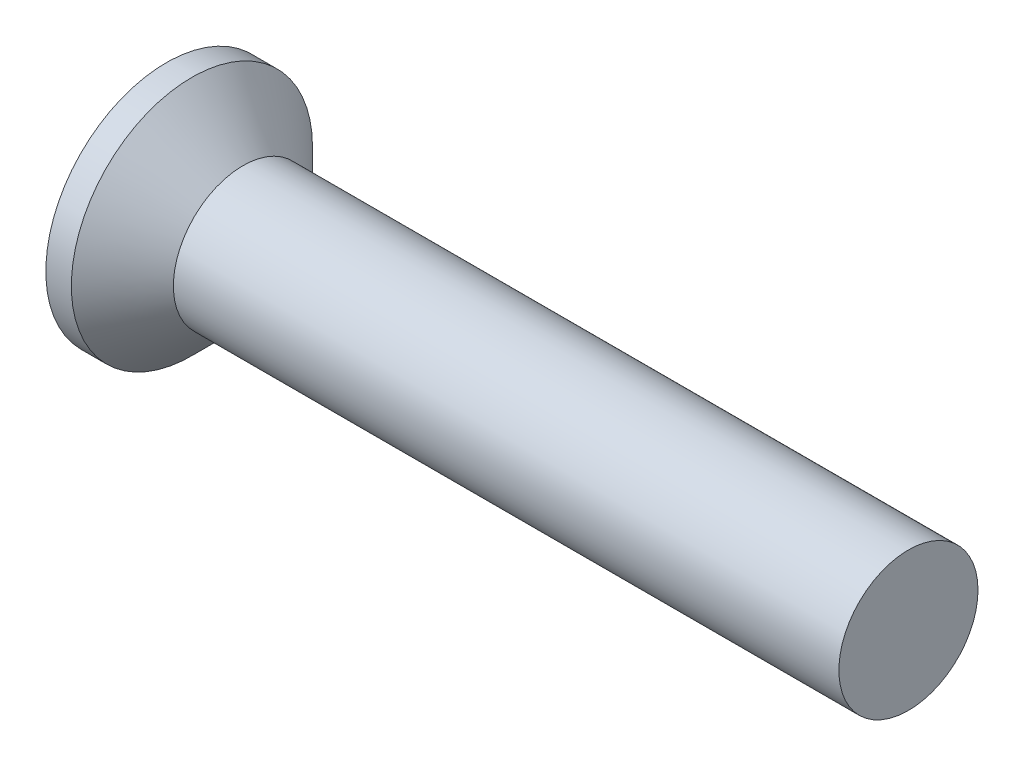
ISO-10303-21;
HEADER;
FILE_DESCRIPTION(('STEP AP214'),'2;1');
FILE_NAME('part.step','',(''),(''),'','','');
FILE_SCHEMA(('AUTOMOTIVE_DESIGN { 1 0 10303 214 1 1 1 1 }'));
ENDSEC;
DATA;
#1=APPLICATION_CONTEXT('core data for automotive mechanical design processes');
#2=APPLICATION_PROTOCOL_DEFINITION('international standard','automotive_design',2000,#1);
#3=PRODUCT_CONTEXT('',#1,'mechanical');
#4=PRODUCT('Part','Part','',(#3));
#5=PRODUCT_RELATED_PRODUCT_CATEGORY('part','',(#4));
#6=PRODUCT_DEFINITION_FORMATION('','',#4);
#7=PRODUCT_DEFINITION_CONTEXT('part definition',#1,'design');
#8=PRODUCT_DEFINITION('design','',#6,#7);
#9=PRODUCT_DEFINITION_SHAPE('','',#8);
#10=(LENGTH_UNIT() NAMED_UNIT(*) SI_UNIT(.MILLI.,.METRE.));
#11=(NAMED_UNIT(*) PLANE_ANGLE_UNIT() SI_UNIT($,.RADIAN.));
#12=(NAMED_UNIT(*) SI_UNIT($,.STERADIAN.) SOLID_ANGLE_UNIT());
#13=UNCERTAINTY_MEASURE_WITH_UNIT(LENGTH_MEASURE(1.E-05),#10,'distance_accuracy_value','');
#14=(GEOMETRIC_REPRESENTATION_CONTEXT(3) GLOBAL_UNCERTAINTY_ASSIGNED_CONTEXT((#13)) GLOBAL_UNIT_ASSIGNED_CONTEXT((#10,
#11,#12)) REPRESENTATION_CONTEXT('',''));
#15=CARTESIAN_POINT('',(0.,0.,0.));
#16=DIRECTION('',(0.,0.,1.));
#17=DIRECTION('',(1.,0.,0.));
#18=AXIS2_PLACEMENT_3D('',#15,#16,#17);
#19=CARTESIAN_POINT('',(0.,2.59999999999999,0.));
#20=DIRECTION('',(-1.,0.,0.));
#21=DIRECTION('',(0.,0.,1.));
#22=AXIS2_PLACEMENT_3D('',#19,#20,#21);
#23=PLANE('',#22);
#24=CARTESIAN_POINT('',(0.,0.,0.));
#25=DIRECTION('',(1.,0.,0.));
#26=DIRECTION('',(0.,0.,-1.));
#27=AXIS2_PLACEMENT_3D('',#24,#25,#26);
#28=CIRCLE('',#27,2.59999999999999);
#29=CARTESIAN_POINT('',(0.,0.,-2.59999999999999));
#30=VERTEX_POINT('',#29);
#31=EDGE_CURVE('E205',#30,#30,#28,.T.);
#32=ORIENTED_EDGE('',*,*,#31,.F.);
#33=EDGE_LOOP('',(#32));
#34=FACE_BOUND('',#33,.T.);
#35=DIRECTION('',(0.,1.,0.));
#36=VECTOR('',#35,1.);
#37=CARTESIAN_POINT('',(0.,-0.32,-0.32));
#38=LINE('',#37,#36);
#39=CARTESIAN_POINT('',(0.,-1.6,-0.32));
#40=VERTEX_POINT('',#39);
#41=CARTESIAN_POINT('',(0.,-0.62,-0.32));
#42=VERTEX_POINT('',#41);
#43=EDGE_CURVE('E354',#40,#42,#38,.T.);
#44=ORIENTED_EDGE('',*,*,#43,.T.);
#45=CARTESIAN_POINT('',(0.,-0.62,-0.62));
#46=DIRECTION('',(-1.,0.,0.));
#47=DIRECTION('',(0.,0.,1.));
#48=AXIS2_PLACEMENT_3D('',#45,#46,#47);
#49=CIRCLE('',#48,0.3);
#50=CARTESIAN_POINT('',(0.,-0.32,-0.62));
#51=VERTEX_POINT('',#50);
#52=EDGE_CURVE('E213',#42,#51,#49,.T.);
#53=ORIENTED_EDGE('',*,*,#52,.T.);
#54=DIRECTION('',(0.,0.,-1.));
#55=VECTOR('',#54,1.);
#56=CARTESIAN_POINT('',(0.,-0.32,-0.32));
#57=LINE('',#56,#55);
#58=CARTESIAN_POINT('',(0.,-0.32,-1.6));
#59=VERTEX_POINT('',#58);
#60=EDGE_CURVE('E357',#51,#59,#57,.T.);
#61=ORIENTED_EDGE('',*,*,#60,.T.);
#62=DIRECTION('',(0.,1.,0.));
#63=VECTOR('',#62,1.);
#64=CARTESIAN_POINT('',(0.,0.32,-1.6));
#65=LINE('',#64,#63);
#66=CARTESIAN_POINT('',(0.,0.32,-1.6));
#67=VERTEX_POINT('',#66);
#68=EDGE_CURVE('E360',#59,#67,#65,.T.);
#69=ORIENTED_EDGE('',*,*,#68,.T.);
#70=DIRECTION('',(0.,0.,1.));
#71=VECTOR('',#70,1.);
#72=CARTESIAN_POINT('',(0.,0.32,-0.32));
#73=LINE('',#72,#71);
#74=CARTESIAN_POINT('',(0.,0.32,-0.62));
#75=VERTEX_POINT('',#74);
#76=EDGE_CURVE('E364',#67,#75,#73,.T.);
#77=ORIENTED_EDGE('',*,*,#76,.T.);
#78=CARTESIAN_POINT('',(0.,0.62,-0.62));
#79=DIRECTION('',(-1.,0.,0.));
#80=DIRECTION('',(0.,0.,1.));
#81=AXIS2_PLACEMENT_3D('',#78,#79,#80);
#82=CIRCLE('',#81,0.3);
#83=CARTESIAN_POINT('',(0.,0.62,-0.32));
#84=VERTEX_POINT('',#83);
#85=EDGE_CURVE('E210',#75,#84,#82,.T.);
#86=ORIENTED_EDGE('',*,*,#85,.T.);
#87=DIRECTION('',(0.,1.,0.));
#88=VECTOR('',#87,1.);
#89=CARTESIAN_POINT('',(0.,0.32,-0.32));
#90=LINE('',#89,#88);
#91=CARTESIAN_POINT('',(0.,1.6,-0.32));
#92=VERTEX_POINT('',#91);
#93=EDGE_CURVE('E368',#84,#92,#90,.T.);
#94=ORIENTED_EDGE('',*,*,#93,.T.);
#95=DIRECTION('',(0.,0.,1.));
#96=VECTOR('',#95,1.);
#97=CARTESIAN_POINT('',(0.,1.6,-0.32));
#98=LINE('',#97,#96);
#99=CARTESIAN_POINT('',(0.,1.6,0.32));
#100=VERTEX_POINT('',#99);
#101=EDGE_CURVE('E371',#92,#100,#98,.T.);
#102=ORIENTED_EDGE('',*,*,#101,.T.);
#103=DIRECTION('',(0.,-1.,0.));
#104=VECTOR('',#103,1.);
#105=CARTESIAN_POINT('',(0.,0.32,0.32));
#106=LINE('',#105,#104);
#107=CARTESIAN_POINT('',(0.,0.62,0.32));
#108=VERTEX_POINT('',#107);
#109=EDGE_CURVE('E375',#100,#108,#106,.T.);
#110=ORIENTED_EDGE('',*,*,#109,.T.);
#111=CARTESIAN_POINT('',(0.,0.62,0.62));
#112=DIRECTION('',(-1.,0.,0.));
#113=DIRECTION('',(0.,0.,1.));
#114=AXIS2_PLACEMENT_3D('',#111,#112,#113);
#115=CIRCLE('',#114,0.3);
#116=CARTESIAN_POINT('',(0.,0.32,0.62));
#117=VERTEX_POINT('',#116);
#118=EDGE_CURVE('E167',#108,#117,#115,.T.);
#119=ORIENTED_EDGE('',*,*,#118,.T.);
#120=DIRECTION('',(0.,0.,1.));
#121=VECTOR('',#120,1.);
#122=CARTESIAN_POINT('',(0.,0.32,0.32));
#123=LINE('',#122,#121);
#124=CARTESIAN_POINT('',(0.,0.32,1.6));
#125=VERTEX_POINT('',#124);
#126=EDGE_CURVE('E161',#117,#125,#123,.T.);
#127=ORIENTED_EDGE('',*,*,#126,.T.);
#128=DIRECTION('',(0.,-1.,0.));
#129=VECTOR('',#128,1.);
#130=CARTESIAN_POINT('',(0.,0.32,1.6));
#131=LINE('',#130,#129);
#132=CARTESIAN_POINT('',(0.,-0.32,1.6));
#133=VERTEX_POINT('',#132);
#134=EDGE_CURVE('E165',#125,#133,#131,.T.);
#135=ORIENTED_EDGE('',*,*,#134,.T.);
#136=DIRECTION('',(0.,0.,-1.));
#137=VECTOR('',#136,1.);
#138=CARTESIAN_POINT('',(0.,-0.32,0.32));
#139=LINE('',#138,#137);
#140=CARTESIAN_POINT('',(0.,-0.32,0.62));
#141=VERTEX_POINT('',#140);
#142=EDGE_CURVE('E181',#133,#141,#139,.T.);
#143=ORIENTED_EDGE('',*,*,#142,.T.);
#144=CARTESIAN_POINT('',(0.,-0.62,0.62));
#145=DIRECTION('',(-1.,0.,0.));
#146=DIRECTION('',(0.,0.,1.));
#147=AXIS2_PLACEMENT_3D('',#144,#145,#146);
#148=CIRCLE('',#147,0.3);
#149=CARTESIAN_POINT('',(0.,-0.62,0.32));
#150=VERTEX_POINT('',#149);
#151=EDGE_CURVE('E204',#141,#150,#148,.T.);
#152=ORIENTED_EDGE('',*,*,#151,.T.);
#153=DIRECTION('',(0.,-1.,0.));
#154=VECTOR('',#153,1.);
#155=CARTESIAN_POINT('',(0.,-0.32,0.32));
#156=LINE('',#155,#154);
#157=CARTESIAN_POINT('',(0.,-1.6,0.32));
#158=VERTEX_POINT('',#157);
#159=EDGE_CURVE('E347',#150,#158,#156,.T.);
#160=ORIENTED_EDGE('',*,*,#159,.T.);
#161=DIRECTION('',(0.,0.,-1.));
#162=VECTOR('',#161,1.);
#163=CARTESIAN_POINT('',(0.,-1.6,-0.32));
#164=LINE('',#163,#162);
#165=EDGE_CURVE('E350',#158,#40,#164,.T.);
#166=ORIENTED_EDGE('',*,*,#165,.T.);
#167=EDGE_LOOP('',(#44,#53,#61,#69,#77,#86,#94,#102,#110,#119,#127,#135,#143,#152,#160,#166));
#168=FACE_BOUND('',#167,.T.);
#169=ADVANCED_FACE('F47',(#34,#168),#23,.T.);
#170=CARTESIAN_POINT('',(16.,1.5,0.));
#171=DIRECTION('',(1.,0.,0.));
#172=DIRECTION('',(0.,0.,-1.));
#173=AXIS2_PLACEMENT_3D('',#170,#171,#172);
#174=PLANE('',#173);
#175=CARTESIAN_POINT('',(16.,0.,0.));
#176=DIRECTION('',(1.,0.,0.));
#177=DIRECTION('',(0.,0.,-1.));
#178=AXIS2_PLACEMENT_3D('',#175,#176,#177);
#179=CIRCLE('',#178,1.5);
#180=CARTESIAN_POINT('',(16.,0.,-1.5));
#181=VERTEX_POINT('',#180);
#182=EDGE_CURVE('E188',#181,#181,#179,.T.);
#183=ORIENTED_EDGE('',*,*,#182,.T.);
#184=EDGE_LOOP('',(#183));
#185=FACE_BOUND('',#184,.T.);
#186=ADVANCED_FACE('F273',(#185),#174,.T.);
#187=CARTESIAN_POINT('',(4.51581291088132,0.,0.));
#188=DIRECTION('',(1.,0.,0.));
#189=DIRECTION('',(0.,0.,-1.));
#190=AXIS2_PLACEMENT_3D('',#187,#188,#189);
#191=CYLINDRICAL_SURFACE('',#190,2.59999999999999);
#192=ORIENTED_EDGE('',*,*,#31,.T.);
#193=EDGE_LOOP('',(#192));
#194=FACE_BOUND('',#193,.T.);
#195=CARTESIAN_POINT('',(0.550000000000005,0.,0.));
#196=DIRECTION('',(1.,0.,0.));
#197=DIRECTION('',(0.,0.,-1.));
#198=AXIS2_PLACEMENT_3D('',#195,#196,#197);
#199=CIRCLE('',#198,2.59999999999999);
#200=CARTESIAN_POINT('',(0.550000000000005,0.,-2.59999999999999));
#201=VERTEX_POINT('',#200);
#202=EDGE_CURVE('E381',#201,#201,#199,.T.);
#203=ORIENTED_EDGE('',*,*,#202,.F.);
#204=EDGE_LOOP('',(#203));
#205=FACE_BOUND('',#204,.T.);
#206=ADVANCED_FACE('F279',(#194,#205),#191,.T.);
#207=CARTESIAN_POINT('',(1.65,0.,0.));
#208=DIRECTION('',(-1.,0.,0.));
#209=DIRECTION('',(0.,0.,1.));
#210=AXIS2_PLACEMENT_3D('',#207,#208,#209);
#211=CONICAL_SURFACE('',#210,1.49999999999999,0.78539816339745);
#212=ORIENTED_EDGE('',*,*,#202,.T.);
#213=EDGE_LOOP('',(#212));
#214=FACE_BOUND('',#213,.T.);
#215=CARTESIAN_POINT('',(1.65,0.,0.));
#216=DIRECTION('',(1.,0.,0.));
#217=DIRECTION('',(0.,0.,-1.));
#218=AXIS2_PLACEMENT_3D('',#215,#216,#217);
#219=CIRCLE('',#218,1.49999999999999);
#220=CARTESIAN_POINT('',(1.65,0.,-1.49999999999999));
#221=VERTEX_POINT('',#220);
#222=EDGE_CURVE('E193',#221,#221,#219,.T.);
#223=ORIENTED_EDGE('',*,*,#222,.F.);
#224=EDGE_LOOP('',(#223));
#225=FACE_BOUND('',#224,.T.);
#226=ADVANCED_FACE('F431',(#214,#225),#211,.T.);
#227=CARTESIAN_POINT('',(4.51581291088132,0.,0.));
#228=DIRECTION('',(1.,0.,0.));
#229=DIRECTION('',(0.,0.,-1.));
#230=AXIS2_PLACEMENT_3D('',#227,#228,#229);
#231=CYLINDRICAL_SURFACE('',#230,1.5);
#232=ORIENTED_EDGE('',*,*,#222,.T.);
#233=EDGE_LOOP('',(#232));
#234=FACE_BOUND('',#233,.T.);
#235=ORIENTED_EDGE('',*,*,#182,.F.);
#236=EDGE_LOOP('',(#235));
#237=FACE_BOUND('',#236,.T.);
#238=ADVANCED_FACE('F429',(#234,#237),#231,.T.);
#239=CARTESIAN_POINT('',(0.825,0.32,0.32));
#240=DIRECTION('',(0.,-1.,0.));
#241=DIRECTION('',(0.,0.,-1.));
#242=AXIS2_PLACEMENT_3D('',#239,#240,#241);
#243=PLANE('',#242);
#244=ORIENTED_EDGE('',*,*,#126,.F.);
#245=DIRECTION('',(-1.,0.,0.));
#246=VECTOR('',#245,1.);
#247=CARTESIAN_POINT('',(0.825,0.32,0.62));
#248=LINE('',#247,#246);
#249=CARTESIAN_POINT('',(0.825,0.32,0.62));
#250=VERTEX_POINT('',#249);
#251=EDGE_CURVE('E230',#117,#250,#248,.F.);
#252=ORIENTED_EDGE('',*,*,#251,.T.);
#253=DIRECTION('',(0.,0.,1.));
#254=VECTOR('',#253,1.);
#255=CARTESIAN_POINT('',(0.825,0.32,0.32));
#256=LINE('',#255,#254);
#257=CARTESIAN_POINT('',(0.825,0.32,1.12368602791856));
#258=VERTEX_POINT('',#257);
#259=EDGE_CURVE('E185',#250,#258,#256,.T.);
#260=ORIENTED_EDGE('',*,*,#259,.T.);
#261=DIRECTION('',(-0.866025403784438,0.,0.500000000000001));
#262=VECTOR('',#261,1.);
#263=CARTESIAN_POINT('',(0.,0.32,1.6));
#264=LINE('',#263,#262);
#265=EDGE_CURVE('E176',#258,#125,#264,.T.);
#266=ORIENTED_EDGE('',*,*,#265,.T.);
#267=EDGE_LOOP('',(#244,#252,#260,#266));
#268=FACE_BOUND('',#267,.T.);
#269=ADVANCED_FACE('F183',(#268),#243,.T.);
#270=CARTESIAN_POINT('',(0.,0.32,1.6));
#271=DIRECTION('',(-0.500000000000001,0.,-0.866025403784438));
#272=DIRECTION('',(-0.866025403784438,0.,0.500000000000001));
#273=AXIS2_PLACEMENT_3D('',#270,#271,#272);
#274=PLANE('',#273);
#275=ORIENTED_EDGE('',*,*,#134,.F.);
#276=ORIENTED_EDGE('',*,*,#265,.F.);
#277=DIRECTION('',(0.,-1.,0.));
#278=VECTOR('',#277,1.);
#279=CARTESIAN_POINT('',(0.825,0.32,1.12368602791856));
#280=LINE('',#279,#278);
#281=CARTESIAN_POINT('',(0.825,-0.32,1.12368602791856));
#282=VERTEX_POINT('',#281);
#283=EDGE_CURVE('E199',#258,#282,#280,.T.);
#284=ORIENTED_EDGE('',*,*,#283,.T.);
#285=DIRECTION('',(-0.866025403784438,0.,0.500000000000001));
#286=VECTOR('',#285,1.);
#287=CARTESIAN_POINT('',(1.17300625842204,-0.32,0.922764520938917));
#288=LINE('',#287,#286);
#289=EDGE_CURVE('E178',#282,#133,#288,.T.);
#290=ORIENTED_EDGE('',*,*,#289,.T.);
#291=EDGE_LOOP('',(#275,#276,#284,#290));
#292=FACE_BOUND('',#291,.T.);
#293=ADVANCED_FACE('F175',(#292),#274,.T.);
#294=CARTESIAN_POINT('',(0.825,-0.32,0.32));
#295=DIRECTION('',(0.,1.,0.));
#296=DIRECTION('',(0.,0.,1.));
#297=AXIS2_PLACEMENT_3D('',#294,#295,#296);
#298=PLANE('',#297);
#299=DIRECTION('',(0.,0.,-1.));
#300=VECTOR('',#299,1.);
#301=CARTESIAN_POINT('',(0.825,-0.32,0.32));
#302=LINE('',#301,#300);
#303=CARTESIAN_POINT('',(0.825,-0.32,0.62));
#304=VERTEX_POINT('',#303);
#305=EDGE_CURVE('E413',#282,#304,#302,.T.);
#306=ORIENTED_EDGE('',*,*,#305,.T.);
#307=DIRECTION('',(-1.,0.,0.));
#308=VECTOR('',#307,1.);
#309=CARTESIAN_POINT('',(0.825,-0.32,0.62));
#310=LINE('',#309,#308);
#311=EDGE_CURVE('E233',#304,#141,#310,.T.);
#312=ORIENTED_EDGE('',*,*,#311,.T.);
#313=ORIENTED_EDGE('',*,*,#142,.F.);
#314=ORIENTED_EDGE('',*,*,#289,.F.);
#315=EDGE_LOOP('',(#306,#312,#313,#314));
#316=FACE_BOUND('',#315,.T.);
#317=ADVANCED_FACE('F293',(#316),#298,.T.);
#318=CARTESIAN_POINT('',(0.825,-0.32,0.32));
#319=DIRECTION('',(0.,0.,-1.));
#320=DIRECTION('',(0.,1.,0.));
#321=AXIS2_PLACEMENT_3D('',#318,#319,#320);
#322=PLANE('',#321);
#323=ORIENTED_EDGE('',*,*,#159,.F.);
#324=DIRECTION('',(-1.,0.,0.));
#325=VECTOR('',#324,1.);
#326=CARTESIAN_POINT('',(0.825,-0.62,0.32));
#327=LINE('',#326,#325);
#328=CARTESIAN_POINT('',(0.825,-0.62,0.32));
#329=VERTEX_POINT('',#328);
#330=EDGE_CURVE('E63',#150,#329,#327,.F.);
#331=ORIENTED_EDGE('',*,*,#330,.T.);
#332=DIRECTION('',(0.,-1.,0.));
#333=VECTOR('',#332,1.);
#334=CARTESIAN_POINT('',(0.825,-0.32,0.32));
#335=LINE('',#334,#333);
#336=CARTESIAN_POINT('',(0.825,-1.12368602791856,0.32));
#337=VERTEX_POINT('',#336);
#338=EDGE_CURVE('E333',#329,#337,#335,.T.);
#339=ORIENTED_EDGE('',*,*,#338,.T.);
#340=DIRECTION('',(-0.866025403784438,-0.500000000000001,0.));
#341=VECTOR('',#340,1.);
#342=CARTESIAN_POINT('',(0.,-1.6,0.32));
#343=LINE('',#342,#341);
#344=EDGE_CURVE('E195',#337,#158,#343,.T.);
#345=ORIENTED_EDGE('',*,*,#344,.T.);
#346=EDGE_LOOP('',(#323,#331,#339,#345));
#347=FACE_BOUND('',#346,.T.);
#348=ADVANCED_FACE('F298',(#347),#322,.T.);
#349=CARTESIAN_POINT('',(0.,-1.6,-0.32));
#350=DIRECTION('',(-0.500000000000001,0.866025403784438,0.));
#351=DIRECTION('',(-0.866025403784438,-0.500000000000001,0.));
#352=AXIS2_PLACEMENT_3D('',#349,#350,#351);
#353=PLANE('',#352);
#354=ORIENTED_EDGE('',*,*,#165,.F.);
#355=ORIENTED_EDGE('',*,*,#344,.F.);
#356=DIRECTION('',(0.,0.,-1.));
#357=VECTOR('',#356,1.);
#358=CARTESIAN_POINT('',(0.825,-1.12368602791856,0.32));
#359=LINE('',#358,#357);
#360=CARTESIAN_POINT('',(0.825,-1.12368602791856,-0.32));
#361=VERTEX_POINT('',#360);
#362=EDGE_CURVE('E327',#337,#361,#359,.T.);
#363=ORIENTED_EDGE('',*,*,#362,.T.);
#364=DIRECTION('',(-0.866025403784438,-0.500000000000001,0.));
#365=VECTOR('',#364,1.);
#366=CARTESIAN_POINT('',(1.17300625842204,-0.922764520938917,-0.32));
#367=LINE('',#366,#365);
#368=EDGE_CURVE('E325',#361,#40,#367,.T.);
#369=ORIENTED_EDGE('',*,*,#368,.T.);
#370=EDGE_LOOP('',(#354,#355,#363,#369));
#371=FACE_BOUND('',#370,.T.);
#372=ADVANCED_FACE('F294',(#371),#353,.T.);
#373=CARTESIAN_POINT('',(0.825,-0.32,-0.32));
#374=DIRECTION('',(0.,0.,1.));
#375=DIRECTION('',(1.,0.,0.));
#376=AXIS2_PLACEMENT_3D('',#373,#374,#375);
#377=PLANE('',#376);
#378=DIRECTION('',(0.,1.,0.));
#379=VECTOR('',#378,1.);
#380=CARTESIAN_POINT('',(0.825,-0.32,-0.32));
#381=LINE('',#380,#379);
#382=CARTESIAN_POINT('',(0.825,-0.62,-0.32));
#383=VERTEX_POINT('',#382);
#384=EDGE_CURVE('E319',#361,#383,#381,.T.);
#385=ORIENTED_EDGE('',*,*,#384,.T.);
#386=DIRECTION('',(-1.,0.,0.));
#387=VECTOR('',#386,1.);
#388=CARTESIAN_POINT('',(0.825,-0.62,-0.32));
#389=LINE('',#388,#387);
#390=EDGE_CURVE('E200',#383,#42,#389,.T.);
#391=ORIENTED_EDGE('',*,*,#390,.T.);
#392=ORIENTED_EDGE('',*,*,#43,.F.);
#393=ORIENTED_EDGE('',*,*,#368,.F.);
#394=EDGE_LOOP('',(#385,#391,#392,#393));
#395=FACE_BOUND('',#394,.T.);
#396=ADVANCED_FACE('F297',(#395),#377,.T.);
#397=CARTESIAN_POINT('',(0.825,-0.32,-0.32));
#398=DIRECTION('',(0.,1.,0.));
#399=DIRECTION('',(0.,0.,1.));
#400=AXIS2_PLACEMENT_3D('',#397,#398,#399);
#401=PLANE('',#400);
#402=ORIENTED_EDGE('',*,*,#60,.F.);
#403=DIRECTION('',(-1.,0.,0.));
#404=VECTOR('',#403,1.);
#405=CARTESIAN_POINT('',(0.825,-0.32,-0.62));
#406=LINE('',#405,#404);
#407=CARTESIAN_POINT('',(0.825,-0.32,-0.62));
#408=VERTEX_POINT('',#407);
#409=EDGE_CURVE('E216',#51,#408,#406,.F.);
#410=ORIENTED_EDGE('',*,*,#409,.T.);
#411=DIRECTION('',(0.,0.,-1.));
#412=VECTOR('',#411,1.);
#413=CARTESIAN_POINT('',(0.825,-0.32,-0.32));
#414=LINE('',#413,#412);
#415=CARTESIAN_POINT('',(0.825,-0.32,-1.12368602791856));
#416=VERTEX_POINT('',#415);
#417=EDGE_CURVE('E321',#408,#416,#414,.T.);
#418=ORIENTED_EDGE('',*,*,#417,.T.);
#419=DIRECTION('',(-0.866025403784438,0.,-0.500000000000001));
#420=VECTOR('',#419,1.);
#421=CARTESIAN_POINT('',(0.,-0.32,-1.6));
#422=LINE('',#421,#420);
#423=EDGE_CURVE('E399',#416,#59,#422,.T.);
#424=ORIENTED_EDGE('',*,*,#423,.T.);
#425=EDGE_LOOP('',(#402,#410,#418,#424));
#426=FACE_BOUND('',#425,.T.);
#427=ADVANCED_FACE('F304',(#426),#401,.T.);
#428=CARTESIAN_POINT('',(0.,0.32,-1.6));
#429=DIRECTION('',(-0.500000000000001,0.,0.866025403784438));
#430=DIRECTION('',(0.866025403784438,0.,0.500000000000001));
#431=AXIS2_PLACEMENT_3D('',#428,#429,#430);
#432=PLANE('',#431);
#433=ORIENTED_EDGE('',*,*,#68,.F.);
#434=ORIENTED_EDGE('',*,*,#423,.F.);
#435=DIRECTION('',(0.,1.,0.));
#436=VECTOR('',#435,1.);
#437=CARTESIAN_POINT('',(0.825,0.32,-1.12368602791856));
#438=LINE('',#437,#436);
#439=CARTESIAN_POINT('',(0.825,0.32,-1.12368602791856));
#440=VERTEX_POINT('',#439);
#441=EDGE_CURVE('E331',#416,#440,#438,.T.);
#442=ORIENTED_EDGE('',*,*,#441,.T.);
#443=DIRECTION('',(-0.866025403784438,0.,-0.500000000000001));
#444=VECTOR('',#443,1.);
#445=CARTESIAN_POINT('',(1.17300625842204,0.32,-0.922764520938917));
#446=LINE('',#445,#444);
#447=EDGE_CURVE('E396',#440,#67,#446,.T.);
#448=ORIENTED_EDGE('',*,*,#447,.T.);
#449=EDGE_LOOP('',(#433,#434,#442,#448));
#450=FACE_BOUND('',#449,.T.);
#451=ADVANCED_FACE('F300',(#450),#432,.T.);
#452=CARTESIAN_POINT('',(0.825,0.32,-0.32));
#453=DIRECTION('',(0.,-1.,0.));
#454=DIRECTION('',(0.,0.,-1.));
#455=AXIS2_PLACEMENT_3D('',#452,#453,#454);
#456=PLANE('',#455);
#457=DIRECTION('',(0.,0.,1.));
#458=VECTOR('',#457,1.);
#459=CARTESIAN_POINT('',(0.825,0.32,-0.32));
#460=LINE('',#459,#458);
#461=CARTESIAN_POINT('',(0.825,0.32,-0.62));
#462=VERTEX_POINT('',#461);
#463=EDGE_CURVE('E338',#440,#462,#460,.T.);
#464=ORIENTED_EDGE('',*,*,#463,.T.);
#465=DIRECTION('',(-1.,0.,0.));
#466=VECTOR('',#465,1.);
#467=CARTESIAN_POINT('',(0.825,0.32,-0.62));
#468=LINE('',#467,#466);
#469=EDGE_CURVE('E219',#462,#75,#468,.T.);
#470=ORIENTED_EDGE('',*,*,#469,.T.);
#471=ORIENTED_EDGE('',*,*,#76,.F.);
#472=ORIENTED_EDGE('',*,*,#447,.F.);
#473=EDGE_LOOP('',(#464,#470,#471,#472));
#474=FACE_BOUND('',#473,.T.);
#475=ADVANCED_FACE('F303',(#474),#456,.T.);
#476=CARTESIAN_POINT('',(0.825,0.32,-0.32));
#477=DIRECTION('',(0.,0.,1.));
#478=DIRECTION('',(1.,0.,0.));
#479=AXIS2_PLACEMENT_3D('',#476,#477,#478);
#480=PLANE('',#479);
#481=ORIENTED_EDGE('',*,*,#93,.F.);
#482=DIRECTION('',(-1.,0.,0.));
#483=VECTOR('',#482,1.);
#484=CARTESIAN_POINT('',(0.825,0.62,-0.32));
#485=LINE('',#484,#483);
#486=CARTESIAN_POINT('',(0.825,0.62,-0.32));
#487=VERTEX_POINT('',#486);
#488=EDGE_CURVE('E223',#84,#487,#485,.F.);
#489=ORIENTED_EDGE('',*,*,#488,.T.);
#490=DIRECTION('',(0.,1.,0.));
#491=VECTOR('',#490,1.);
#492=CARTESIAN_POINT('',(0.825,0.32,-0.32));
#493=LINE('',#492,#491);
#494=CARTESIAN_POINT('',(0.825,1.12368602791856,-0.32));
#495=VERTEX_POINT('',#494);
#496=EDGE_CURVE('E342',#487,#495,#493,.T.);
#497=ORIENTED_EDGE('',*,*,#496,.T.);
#498=DIRECTION('',(-0.866025403784438,0.500000000000001,0.));
#499=VECTOR('',#498,1.);
#500=CARTESIAN_POINT('',(0.,1.6,-0.32));
#501=LINE('',#500,#499);
#502=EDGE_CURVE('E390',#495,#92,#501,.T.);
#503=ORIENTED_EDGE('',*,*,#502,.T.);
#504=EDGE_LOOP('',(#481,#489,#497,#503));
#505=FACE_BOUND('',#504,.T.);
#506=ADVANCED_FACE('F289',(#505),#480,.T.);
#507=CARTESIAN_POINT('',(0.,1.6,-0.32));
#508=DIRECTION('',(-0.500000000000001,-0.866025403784438,0.));
#509=DIRECTION('',(0.866025403784438,-0.500000000000001,0.));
#510=AXIS2_PLACEMENT_3D('',#507,#508,#509);
#511=PLANE('',#510);
#512=ORIENTED_EDGE('',*,*,#101,.F.);
#513=ORIENTED_EDGE('',*,*,#502,.F.);
#514=DIRECTION('',(0.,0.,1.));
#515=VECTOR('',#514,1.);
#516=CARTESIAN_POINT('',(0.825,1.12368602791856,0.32));
#517=LINE('',#516,#515);
#518=CARTESIAN_POINT('',(0.825,1.12368602791856,0.32));
#519=VERTEX_POINT('',#518);
#520=EDGE_CURVE('E259',#495,#519,#517,.T.);
#521=ORIENTED_EDGE('',*,*,#520,.T.);
#522=DIRECTION('',(-0.866025403784438,0.500000000000001,0.));
#523=VECTOR('',#522,1.);
#524=CARTESIAN_POINT('',(1.17300625842204,0.922764520938917,0.32));
#525=LINE('',#524,#523);
#526=EDGE_CURVE('E257',#519,#100,#525,.T.);
#527=ORIENTED_EDGE('',*,*,#526,.T.);
#528=EDGE_LOOP('',(#512,#513,#521,#527));
#529=FACE_BOUND('',#528,.T.);
#530=ADVANCED_FACE('F286',(#529),#511,.T.);
#531=CARTESIAN_POINT('',(0.825,0.32,0.32));
#532=DIRECTION('',(0.,0.,-1.));
#533=DIRECTION('',(0.,1.,0.));
#534=AXIS2_PLACEMENT_3D('',#531,#532,#533);
#535=PLANE('',#534);
#536=DIRECTION('',(0.,-1.,0.));
#537=VECTOR('',#536,1.);
#538=CARTESIAN_POINT('',(0.825,0.32,0.32));
#539=LINE('',#538,#537);
#540=CARTESIAN_POINT('',(0.825,0.62,0.32));
#541=VERTEX_POINT('',#540);
#542=EDGE_CURVE('E250',#519,#541,#539,.T.);
#543=ORIENTED_EDGE('',*,*,#542,.T.);
#544=DIRECTION('',(-1.,0.,0.));
#545=VECTOR('',#544,1.);
#546=CARTESIAN_POINT('',(0.825,0.62,0.32));
#547=LINE('',#546,#545);
#548=EDGE_CURVE('E226',#541,#108,#547,.T.);
#549=ORIENTED_EDGE('',*,*,#548,.T.);
#550=ORIENTED_EDGE('',*,*,#109,.F.);
#551=ORIENTED_EDGE('',*,*,#526,.F.);
#552=EDGE_LOOP('',(#543,#549,#550,#551));
#553=FACE_BOUND('',#552,.T.);
#554=ADVANCED_FACE('F255',(#553),#535,.T.);
#555=CARTESIAN_POINT('',(0.825,0.32,0.32));
#556=DIRECTION('',(-1.,0.,0.));
#557=DIRECTION('',(0.,0.,1.));
#558=AXIS2_PLACEMENT_3D('',#555,#556,#557);
#559=PLANE('',#558);
#560=ORIENTED_EDGE('',*,*,#259,.F.);
#561=CARTESIAN_POINT('',(0.825,0.62,0.62));
#562=DIRECTION('',(-1.,0.,0.));
#563=DIRECTION('',(0.,0.,1.));
#564=AXIS2_PLACEMENT_3D('',#561,#562,#563);
#565=CIRCLE('',#564,0.3);
#566=EDGE_CURVE('E56',#250,#541,#565,.F.);
#567=ORIENTED_EDGE('',*,*,#566,.T.);
#568=ORIENTED_EDGE('',*,*,#542,.F.);
#569=ORIENTED_EDGE('',*,*,#520,.F.);
#570=ORIENTED_EDGE('',*,*,#496,.F.);
#571=CARTESIAN_POINT('',(0.825,0.62,-0.62));
#572=DIRECTION('',(-1.,0.,0.));
#573=DIRECTION('',(0.,0.,1.));
#574=AXIS2_PLACEMENT_3D('',#571,#572,#573);
#575=CIRCLE('',#574,0.3);
#576=EDGE_CURVE('E242',#487,#462,#575,.F.);
#577=ORIENTED_EDGE('',*,*,#576,.T.);
#578=ORIENTED_EDGE('',*,*,#463,.F.);
#579=ORIENTED_EDGE('',*,*,#441,.F.);
#580=ORIENTED_EDGE('',*,*,#417,.F.);
#581=CARTESIAN_POINT('',(0.825,-0.62,-0.62));
#582=DIRECTION('',(-1.,0.,0.));
#583=DIRECTION('',(0.,0.,1.));
#584=AXIS2_PLACEMENT_3D('',#581,#582,#583);
#585=CIRCLE('',#584,0.3);
#586=EDGE_CURVE('E239',#408,#383,#585,.F.);
#587=ORIENTED_EDGE('',*,*,#586,.T.);
#588=ORIENTED_EDGE('',*,*,#384,.F.);
#589=ORIENTED_EDGE('',*,*,#362,.F.);
#590=ORIENTED_EDGE('',*,*,#338,.F.);
#591=CARTESIAN_POINT('',(0.825,-0.62,0.62));
#592=DIRECTION('',(-1.,0.,0.));
#593=DIRECTION('',(0.,0.,1.));
#594=AXIS2_PLACEMENT_3D('',#591,#592,#593);
#595=CIRCLE('',#594,0.3);
#596=EDGE_CURVE('E11',#329,#304,#595,.F.);
#597=ORIENTED_EDGE('',*,*,#596,.T.);
#598=ORIENTED_EDGE('',*,*,#305,.F.);
#599=ORIENTED_EDGE('',*,*,#283,.F.);
#600=EDGE_LOOP('',(#560,#567,#568,#569,#570,#577,#578,#579,#580,#587,#588,#589,#590,#597,#598,#599));
#601=FACE_BOUND('',#600,.T.);
#602=ADVANCED_FACE('F248',(#601),#559,.T.);
#603=CARTESIAN_POINT('',(0.825,-0.62,-0.62));
#604=DIRECTION('',(-1.,0.,0.));
#605=DIRECTION('',(0.,0.,1.));
#606=AXIS2_PLACEMENT_3D('',#603,#604,#605);
#607=CYLINDRICAL_SURFACE('',#606,0.3);
#608=ORIENTED_EDGE('',*,*,#586,.F.);
#609=ORIENTED_EDGE('',*,*,#409,.F.);
#610=ORIENTED_EDGE('',*,*,#52,.F.);
#611=ORIENTED_EDGE('',*,*,#390,.F.);
#612=EDGE_LOOP('',(#608,#609,#610,#611));
#613=FACE_BOUND('',#612,.T.);
#614=ADVANCED_FACE('F269',(#613),#607,.T.);
#615=CARTESIAN_POINT('',(0.825,0.62,-0.62));
#616=DIRECTION('',(-1.,0.,0.));
#617=DIRECTION('',(0.,0.,1.));
#618=AXIS2_PLACEMENT_3D('',#615,#616,#617);
#619=CYLINDRICAL_SURFACE('',#618,0.3);
#620=ORIENTED_EDGE('',*,*,#576,.F.);
#621=ORIENTED_EDGE('',*,*,#488,.F.);
#622=ORIENTED_EDGE('',*,*,#85,.F.);
#623=ORIENTED_EDGE('',*,*,#469,.F.);
#624=EDGE_LOOP('',(#620,#621,#622,#623));
#625=FACE_BOUND('',#624,.T.);
#626=ADVANCED_FACE('F263',(#625),#619,.T.);
#627=CARTESIAN_POINT('',(0.825,0.62,0.62));
#628=DIRECTION('',(-1.,0.,0.));
#629=DIRECTION('',(0.,0.,1.));
#630=AXIS2_PLACEMENT_3D('',#627,#628,#629);
#631=CYLINDRICAL_SURFACE('',#630,0.3);
#632=ORIENTED_EDGE('',*,*,#566,.F.);
#633=ORIENTED_EDGE('',*,*,#251,.F.);
#634=ORIENTED_EDGE('',*,*,#118,.F.);
#635=ORIENTED_EDGE('',*,*,#548,.F.);
#636=EDGE_LOOP('',(#632,#633,#634,#635));
#637=FACE_BOUND('',#636,.T.);
#638=ADVANCED_FACE('F261',(#637),#631,.T.);
#639=CARTESIAN_POINT('',(0.825,-0.62,0.62));
#640=DIRECTION('',(-1.,0.,0.));
#641=DIRECTION('',(0.,0.,1.));
#642=AXIS2_PLACEMENT_3D('',#639,#640,#641);
#643=CYLINDRICAL_SURFACE('',#642,0.3);
#644=ORIENTED_EDGE('',*,*,#596,.F.);
#645=ORIENTED_EDGE('',*,*,#330,.F.);
#646=ORIENTED_EDGE('',*,*,#151,.F.);
#647=ORIENTED_EDGE('',*,*,#311,.F.);
#648=EDGE_LOOP('',(#644,#645,#646,#647));
#649=FACE_BOUND('',#648,.T.);
#650=ADVANCED_FACE('F49',(#649),#643,.T.);
#651=CLOSED_SHELL('',(#169,#186,#206,#226,#238,#269,#293,#317,#348,#372,#396,#427,#451,#475,
#506,#530,#554,#602,#614,#626,#638,#650));
#652=MANIFOLD_SOLID_BREP('B2',#651);
#653=ADVANCED_BREP_SHAPE_REPRESENTATION('',(#18,#652),#14);
#654=SHAPE_DEFINITION_REPRESENTATION(#9,#653);
ENDSEC;
END-ISO-10303-21;
